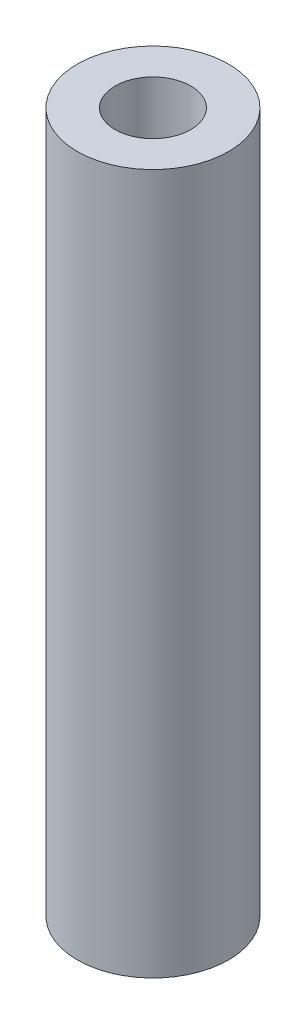
ISO-10303-21;
HEADER;
FILE_DESCRIPTION(('STEP AP214'),'2;1');
FILE_NAME('part.step','',(''),(''),'','','');
FILE_SCHEMA(('AUTOMOTIVE_DESIGN { 1 0 10303 214 1 1 1 1 }'));
ENDSEC;
DATA;
#1=APPLICATION_CONTEXT('core data for automotive mechanical design processes');
#2=APPLICATION_PROTOCOL_DEFINITION('international standard','automotive_design',2000,#1);
#3=PRODUCT_CONTEXT('',#1,'mechanical');
#4=PRODUCT('Part','Part','',(#3));
#5=PRODUCT_RELATED_PRODUCT_CATEGORY('part','',(#4));
#6=PRODUCT_DEFINITION_FORMATION('','',#4);
#7=PRODUCT_DEFINITION_CONTEXT('part definition',#1,'design');
#8=PRODUCT_DEFINITION('design','',#6,#7);
#9=PRODUCT_DEFINITION_SHAPE('','',#8);
#10=(LENGTH_UNIT() NAMED_UNIT(*) SI_UNIT(.MILLI.,.METRE.));
#11=(NAMED_UNIT(*) PLANE_ANGLE_UNIT() SI_UNIT($,.RADIAN.));
#12=(NAMED_UNIT(*) SI_UNIT($,.STERADIAN.) SOLID_ANGLE_UNIT());
#13=UNCERTAINTY_MEASURE_WITH_UNIT(LENGTH_MEASURE(1.E-05),#10,'distance_accuracy_value','');
#14=(GEOMETRIC_REPRESENTATION_CONTEXT(3) GLOBAL_UNCERTAINTY_ASSIGNED_CONTEXT((#13)) GLOBAL_UNIT_ASSIGNED_CONTEXT((#10,
#11,#12)) REPRESENTATION_CONTEXT('',''));
#15=CARTESIAN_POINT('',(0.,0.,0.));
#16=DIRECTION('',(0.,0.,1.));
#17=DIRECTION('',(1.,0.,0.));
#18=AXIS2_PLACEMENT_3D('',#15,#16,#17);
#19=CARTESIAN_POINT('',(0.,37.,0.));
#20=DIRECTION('',(0.,1.,0.));
#21=DIRECTION('',(0.,0.,1.));
#22=AXIS2_PLACEMENT_3D('',#19,#20,#21);
#23=PLANE('',#22);
#24=CARTESIAN_POINT('',(0.,37.,0.));
#25=DIRECTION('',(0.,1.,0.));
#26=DIRECTION('',(0.,0.,1.));
#27=AXIS2_PLACEMENT_3D('',#24,#25,#26);
#28=CIRCLE('',#27,4.);
#29=CARTESIAN_POINT('',(0.,37.,4.));
#30=VERTEX_POINT('',#29);
#31=EDGE_CURVE('E10',#30,#30,#28,.T.);
#32=ORIENTED_EDGE('',*,*,#31,.T.);
#33=EDGE_LOOP('',(#32));
#34=FACE_BOUND('',#33,.T.);
#35=CARTESIAN_POINT('',(0.,37.,0.));
#36=DIRECTION('',(0.,1.,0.));
#37=DIRECTION('',(0.,0.,1.));
#38=AXIS2_PLACEMENT_3D('',#35,#36,#37);
#39=CIRCLE('',#38,2.);
#40=CARTESIAN_POINT('',(0.,37.,2.));
#41=VERTEX_POINT('',#40);
#42=EDGE_CURVE('E42',#41,#41,#39,.T.);
#43=ORIENTED_EDGE('',*,*,#42,.F.);
#44=EDGE_LOOP('',(#43));
#45=FACE_BOUND('',#44,.T.);
#46=ADVANCED_FACE('F31',(#34,#45),#23,.T.);
#47=CARTESIAN_POINT('',(0.,0.,0.));
#48=DIRECTION('',(0.,1.,0.));
#49=DIRECTION('',(0.,0.,1.));
#50=AXIS2_PLACEMENT_3D('',#47,#48,#49);
#51=PLANE('',#50);
#52=CARTESIAN_POINT('',(0.,0.,0.));
#53=DIRECTION('',(0.,1.,0.));
#54=DIRECTION('',(0.,0.,1.));
#55=AXIS2_PLACEMENT_3D('',#52,#53,#54);
#56=CIRCLE('',#55,4.);
#57=CARTESIAN_POINT('',(0.,0.,4.));
#58=VERTEX_POINT('',#57);
#59=EDGE_CURVE('E35',#58,#58,#56,.T.);
#60=ORIENTED_EDGE('',*,*,#59,.F.);
#61=EDGE_LOOP('',(#60));
#62=FACE_BOUND('',#61,.T.);
#63=CARTESIAN_POINT('',(0.,0.,0.));
#64=DIRECTION('',(0.,1.,0.));
#65=DIRECTION('',(0.,0.,1.));
#66=AXIS2_PLACEMENT_3D('',#63,#64,#65);
#67=CIRCLE('',#66,2.);
#68=CARTESIAN_POINT('',(0.,0.,2.));
#69=VERTEX_POINT('',#68);
#70=EDGE_CURVE('E44',#69,#69,#67,.T.);
#71=ORIENTED_EDGE('',*,*,#70,.T.);
#72=EDGE_LOOP('',(#71));
#73=FACE_BOUND('',#72,.T.);
#74=ADVANCED_FACE('F54',(#62,#73),#51,.F.);
#75=CARTESIAN_POINT('',(0.,37.,0.));
#76=DIRECTION('',(0.,-1.,0.));
#77=DIRECTION('',(0.,0.,-1.));
#78=AXIS2_PLACEMENT_3D('',#75,#76,#77);
#79=CYLINDRICAL_SURFACE('',#78,4.);
#80=ORIENTED_EDGE('',*,*,#31,.F.);
#81=EDGE_LOOP('',(#80));
#82=FACE_BOUND('',#81,.T.);
#83=ORIENTED_EDGE('',*,*,#59,.T.);
#84=EDGE_LOOP('',(#83));
#85=FACE_BOUND('',#84,.T.);
#86=ADVANCED_FACE('F33',(#82,#85),#79,.T.);
#87=CARTESIAN_POINT('',(0.,37.,0.));
#88=DIRECTION('',(0.,-1.,0.));
#89=DIRECTION('',(0.,0.,-1.));
#90=AXIS2_PLACEMENT_3D('',#87,#88,#89);
#91=CYLINDRICAL_SURFACE('',#90,2.);
#92=ORIENTED_EDGE('',*,*,#42,.T.);
#93=EDGE_LOOP('',(#92));
#94=FACE_BOUND('',#93,.T.);
#95=ORIENTED_EDGE('',*,*,#70,.F.);
#96=EDGE_LOOP('',(#95));
#97=FACE_BOUND('',#96,.T.);
#98=ADVANCED_FACE('F50',(#94,#97),#91,.F.);
#99=CLOSED_SHELL('',(#46,#74,#86,#98));
#100=MANIFOLD_SOLID_BREP('B2',#99);
#101=ADVANCED_BREP_SHAPE_REPRESENTATION('',(#18,#100),#14);
#102=SHAPE_DEFINITION_REPRESENTATION(#9,#101);
ENDSEC;
END-ISO-10303-21;
